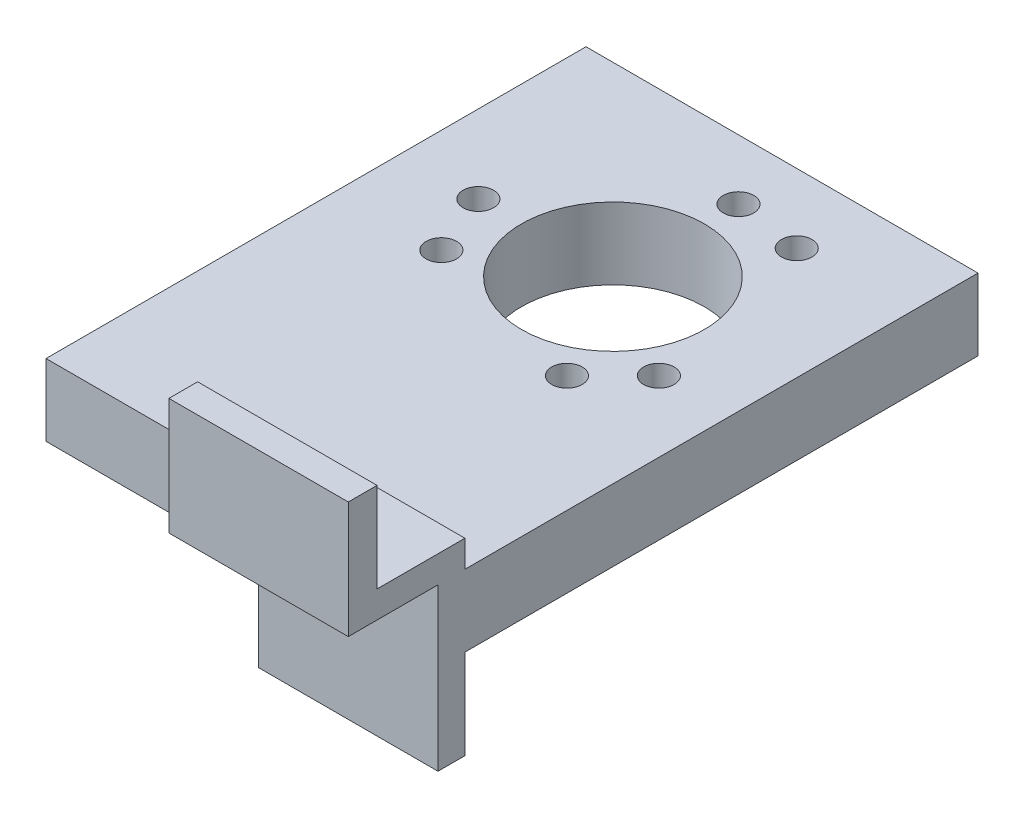
ISO-10303-21;
HEADER;
FILE_DESCRIPTION(('STEP AP214'),'2;1');
FILE_NAME('part.step','',(''),(''),'','','');
FILE_SCHEMA(('AUTOMOTIVE_DESIGN { 1 0 10303 214 1 1 1 1 }'));
ENDSEC;
DATA;
#1=APPLICATION_CONTEXT('core data for automotive mechanical design processes');
#2=APPLICATION_PROTOCOL_DEFINITION('international standard','automotive_design',2000,#1);
#3=PRODUCT_CONTEXT('',#1,'mechanical');
#4=PRODUCT('Part','Part','',(#3));
#5=PRODUCT_RELATED_PRODUCT_CATEGORY('part','',(#4));
#6=PRODUCT_DEFINITION_FORMATION('','',#4);
#7=PRODUCT_DEFINITION_CONTEXT('part definition',#1,'design');
#8=PRODUCT_DEFINITION('design','',#6,#7);
#9=PRODUCT_DEFINITION_SHAPE('','',#8);
#10=(LENGTH_UNIT() NAMED_UNIT(*) SI_UNIT(.MILLI.,.METRE.));
#11=(NAMED_UNIT(*) PLANE_ANGLE_UNIT() SI_UNIT($,.RADIAN.));
#12=(NAMED_UNIT(*) SI_UNIT($,.STERADIAN.) SOLID_ANGLE_UNIT());
#13=UNCERTAINTY_MEASURE_WITH_UNIT(LENGTH_MEASURE(1.E-05),#10,'distance_accuracy_value','');
#14=(GEOMETRIC_REPRESENTATION_CONTEXT(3) GLOBAL_UNCERTAINTY_ASSIGNED_CONTEXT((#13)) GLOBAL_UNIT_ASSIGNED_CONTEXT((#10,
#11,#12)) REPRESENTATION_CONTEXT('',''));
#15=CARTESIAN_POINT('',(0.,0.,0.));
#16=DIRECTION('',(0.,0.,1.));
#17=DIRECTION('',(1.,0.,0.));
#18=AXIS2_PLACEMENT_3D('',#15,#16,#17);
#19=CARTESIAN_POINT('',(0.,8.,0.));
#20=DIRECTION('',(0.,0.,-1.));
#21=DIRECTION('',(-1.,0.,0.));
#22=AXIS2_PLACEMENT_3D('',#19,#20,#21);
#23=PLANE('',#22);
#24=DIRECTION('',(1.,0.,0.));
#25=VECTOR('',#24,1.);
#26=CARTESIAN_POINT('',(0.,8.,0.));
#27=LINE('',#26,#25);
#28=CARTESIAN_POINT('',(0.,8.,0.));
#29=VERTEX_POINT('',#28);
#30=CARTESIAN_POINT('',(20.,8.,0.));
#31=VERTEX_POINT('',#30);
#32=EDGE_CURVE('E62',#29,#31,#27,.T.);
#33=ORIENTED_EDGE('',*,*,#32,.F.);
#34=DIRECTION('',(1.,0.,0.));
#35=VECTOR('',#34,1.);
#36=CARTESIAN_POINT('',(0.,8.,0.));
#37=LINE('',#36,#35);
#38=CARTESIAN_POINT('',(-23.7,8.,0.));
#39=VERTEX_POINT('',#38);
#40=EDGE_CURVE('E250',#39,#29,#37,.T.);
#41=ORIENTED_EDGE('',*,*,#40,.F.);
#42=DIRECTION('',(0.,-1.,0.));
#43=VECTOR('',#42,1.);
#44=CARTESIAN_POINT('',(-23.7,8.,0.));
#45=LINE('',#44,#43);
#46=CARTESIAN_POINT('',(-23.7,0.,0.));
#47=VERTEX_POINT('',#46);
#48=EDGE_CURVE('E287',#39,#47,#45,.T.);
#49=ORIENTED_EDGE('',*,*,#48,.T.);
#50=DIRECTION('',(1.,0.,0.));
#51=VECTOR('',#50,1.);
#52=CARTESIAN_POINT('',(0.,0.,0.));
#53=LINE('',#52,#51);
#54=CARTESIAN_POINT('',(0.,0.,0.));
#55=VERTEX_POINT('',#54);
#56=EDGE_CURVE('E281',#47,#55,#53,.T.);
#57=ORIENTED_EDGE('',*,*,#56,.T.);
#58=DIRECTION('',(0.,1.,0.));
#59=VECTOR('',#58,1.);
#60=CARTESIAN_POINT('',(0.,-10.,0.));
#61=LINE('',#60,#59);
#62=CARTESIAN_POINT('',(0.,-10.,0.));
#63=VERTEX_POINT('',#62);
#64=EDGE_CURVE('E218',#63,#55,#61,.T.);
#65=ORIENTED_EDGE('',*,*,#64,.F.);
#66=DIRECTION('',(-1.,0.,0.));
#67=VECTOR('',#66,1.);
#68=CARTESIAN_POINT('',(20.,-10.,0.));
#69=LINE('',#68,#67);
#70=CARTESIAN_POINT('',(20.,-10.,0.));
#71=VERTEX_POINT('',#70);
#72=EDGE_CURVE('E201',#71,#63,#69,.T.);
#73=ORIENTED_EDGE('',*,*,#72,.F.);
#74=DIRECTION('',(0.,-1.,0.));
#75=VECTOR('',#74,1.);
#76=CARTESIAN_POINT('',(20.,8.,0.));
#77=LINE('',#76,#75);
#78=EDGE_CURVE('E255',#31,#71,#77,.T.);
#79=ORIENTED_EDGE('',*,*,#78,.F.);
#80=EDGE_LOOP('',(#33,#41,#49,#57,#65,#73,#79));
#81=FACE_BOUND('',#80,.T.);
#82=ADVANCED_FACE('F39',(#81),#23,.F.);
#83=CARTESIAN_POINT('',(0.,0.,0.));
#84=DIRECTION('',(0.,1.,0.));
#85=DIRECTION('',(0.,0.,1.));
#86=AXIS2_PLACEMENT_3D('',#83,#84,#85);
#87=PLANE('',#86);
#88=CARTESIAN_POINT('',(-12.1243556529821,0.,-32.5));
#89=DIRECTION('',(0.,1.,0.));
#90=DIRECTION('',(0.,0.,1.));
#91=AXIS2_PLACEMENT_3D('',#88,#89,#90);
#92=CIRCLE('',#91,1.7);
#93=CARTESIAN_POINT('',(-12.1243556529821,0.,-30.8));
#94=VERTEX_POINT('',#93);
#95=EDGE_CURVE('E226',#94,#94,#92,.T.);
#96=ORIENTED_EDGE('',*,*,#95,.T.);
#97=EDGE_LOOP('',(#96));
#98=FACE_BOUND('',#97,.T.);
#99=CARTESIAN_POINT('',(7.,0.,-27.3756443470179));
#100=DIRECTION('',(0.,1.,0.));
#101=DIRECTION('',(0.,0.,1.));
#102=AXIS2_PLACEMENT_3D('',#99,#100,#101);
#103=CIRCLE('',#102,1.7);
#104=CARTESIAN_POINT('',(7.,0.,-25.6756443470179));
#105=VERTEX_POINT('',#104);
#106=EDGE_CURVE('E270',#105,#105,#103,.T.);
#107=ORIENTED_EDGE('',*,*,#106,.T.);
#108=EDGE_LOOP('',(#107));
#109=FACE_BOUND('',#108,.T.);
#110=CARTESIAN_POINT('',(-15.,0.,-39.5));
#111=DIRECTION('',(0.,1.,0.));
#112=DIRECTION('',(0.,0.,1.));
#113=AXIS2_PLACEMENT_3D('',#110,#111,#112);
#114=CIRCLE('',#113,1.7);
#115=CARTESIAN_POINT('',(-15.,0.,-37.8));
#116=VERTEX_POINT('',#115);
#117=EDGE_CURVE('E267',#116,#116,#114,.T.);
#118=ORIENTED_EDGE('',*,*,#117,.T.);
#119=EDGE_LOOP('',(#118));
#120=FACE_BOUND('',#119,.T.);
#121=CARTESIAN_POINT('',(12.1243556529821,0.,-32.5));
#122=DIRECTION('',(0.,1.,0.));
#123=DIRECTION('',(0.,0.,1.));
#124=AXIS2_PLACEMENT_3D('',#121,#122,#123);
#125=CIRCLE('',#124,1.7);
#126=CARTESIAN_POINT('',(12.1243556529821,0.,-30.8));
#127=VERTEX_POINT('',#126);
#128=EDGE_CURVE('E264',#127,#127,#125,.T.);
#129=ORIENTED_EDGE('',*,*,#128,.T.);
#130=EDGE_LOOP('',(#129));
#131=FACE_BOUND('',#130,.T.);
#132=CARTESIAN_POINT('',(0.,0.,-39.5));
#133=DIRECTION('',(0.,1.,0.));
#134=DIRECTION('',(0.,0.,1.));
#135=AXIS2_PLACEMENT_3D('',#132,#133,#134);
#136=CIRCLE('',#135,10.2);
#137=CARTESIAN_POINT('',(0.,0.,-29.3));
#138=VERTEX_POINT('',#137);
#139=EDGE_CURVE('E261',#138,#138,#136,.T.);
#140=ORIENTED_EDGE('',*,*,#139,.T.);
#141=EDGE_LOOP('',(#140));
#142=FACE_BOUND('',#141,.T.);
#143=CARTESIAN_POINT('',(0.,0.,-53.5));
#144=DIRECTION('',(0.,1.,0.));
#145=DIRECTION('',(0.,0.,1.));
#146=AXIS2_PLACEMENT_3D('',#143,#144,#145);
#147=CIRCLE('',#146,1.7);
#148=CARTESIAN_POINT('',(0.,0.,-51.8));
#149=VERTEX_POINT('',#148);
#150=EDGE_CURVE('E258',#149,#149,#147,.T.);
#151=ORIENTED_EDGE('',*,*,#150,.T.);
#152=EDGE_LOOP('',(#151));
#153=FACE_BOUND('',#152,.T.);
#154=CARTESIAN_POINT('',(7.5,0.,-52.4903810567666));
#155=DIRECTION('',(0.,1.,0.));
#156=DIRECTION('',(0.,0.,1.));
#157=AXIS2_PLACEMENT_3D('',#154,#155,#156);
#158=CIRCLE('',#157,1.7);
#159=CARTESIAN_POINT('',(7.5,0.,-50.7903810567666));
#160=VERTEX_POINT('',#159);
#161=EDGE_CURVE('E221',#160,#160,#158,.T.);
#162=ORIENTED_EDGE('',*,*,#161,.T.);
#163=EDGE_LOOP('',(#162));
#164=FACE_BOUND('',#163,.T.);
#165=DIRECTION('',(1.,0.,0.));
#166=VECTOR('',#165,1.);
#167=CARTESIAN_POINT('',(20.,0.,-3.));
#168=LINE('',#167,#166);
#169=CARTESIAN_POINT('',(0.,0.,-3.));
#170=VERTEX_POINT('',#169);
#171=CARTESIAN_POINT('',(20.,0.,-3.));
#172=VERTEX_POINT('',#171);
#173=EDGE_CURVE('E202',#170,#172,#168,.T.);
#174=ORIENTED_EDGE('',*,*,#173,.F.);
#175=DIRECTION('',(0.,0.,-1.));
#176=VECTOR('',#175,1.);
#177=CARTESIAN_POINT('',(0.,0.,0.));
#178=LINE('',#177,#176);
#179=EDGE_CURVE('E197',#55,#170,#178,.T.);
#180=ORIENTED_EDGE('',*,*,#179,.F.);
#181=ORIENTED_EDGE('',*,*,#56,.F.);
#182=DIRECTION('',(0.,0.,-1.));
#183=VECTOR('',#182,1.);
#184=CARTESIAN_POINT('',(-23.7,0.,0.));
#185=LINE('',#184,#183);
#186=CARTESIAN_POINT('',(-23.7,0.,-60.2));
#187=VERTEX_POINT('',#186);
#188=EDGE_CURVE('E278',#47,#187,#185,.T.);
#189=ORIENTED_EDGE('',*,*,#188,.T.);
#190=DIRECTION('',(1.,0.,0.));
#191=VECTOR('',#190,1.);
#192=CARTESIAN_POINT('',(0.,0.,-60.2));
#193=LINE('',#192,#191);
#194=CARTESIAN_POINT('',(20.,0.,-60.2));
#195=VERTEX_POINT('',#194);
#196=EDGE_CURVE('E275',#187,#195,#193,.T.);
#197=ORIENTED_EDGE('',*,*,#196,.T.);
#198=DIRECTION('',(0.,0.,1.));
#199=VECTOR('',#198,1.);
#200=CARTESIAN_POINT('',(20.,0.,0.));
#201=LINE('',#200,#199);
#202=EDGE_CURVE('E273',#195,#172,#201,.T.);
#203=ORIENTED_EDGE('',*,*,#202,.T.);
#204=EDGE_LOOP('',(#174,#180,#181,#189,#197,#203));
#205=FACE_BOUND('',#204,.T.);
#206=ADVANCED_FACE('F299',(#98,#109,#120,#131,#142,#153,#164,#205),#87,.F.);
#207=CARTESIAN_POINT('',(20.,8.,0.));
#208=DIRECTION('',(1.,0.,0.));
#209=DIRECTION('',(0.,0.,-1.));
#210=AXIS2_PLACEMENT_3D('',#207,#208,#209);
#211=PLANE('',#210);
#212=ORIENTED_EDGE('',*,*,#202,.F.);
#213=DIRECTION('',(0.,-1.,0.));
#214=VECTOR('',#213,1.);
#215=CARTESIAN_POINT('',(20.,8.,-60.2));
#216=LINE('',#215,#214);
#217=CARTESIAN_POINT('',(20.,8.,-60.2));
#218=VERTEX_POINT('',#217);
#219=EDGE_CURVE('E11',#218,#195,#216,.T.);
#220=ORIENTED_EDGE('',*,*,#219,.F.);
#221=DIRECTION('',(0.,0.,1.));
#222=VECTOR('',#221,1.);
#223=CARTESIAN_POINT('',(20.,8.,0.));
#224=LINE('',#223,#222);
#225=CARTESIAN_POINT('',(20.,8.,-3.));
#226=VERTEX_POINT('',#225);
#227=EDGE_CURVE('E241',#218,#226,#224,.T.);
#228=ORIENTED_EDGE('',*,*,#227,.T.);
#229=DIRECTION('',(0.,-1.,0.));
#230=VECTOR('',#229,1.);
#231=CARTESIAN_POINT('',(20.,11.,-3.));
#232=LINE('',#231,#230);
#233=CARTESIAN_POINT('',(20.,11.,-3.));
#234=VERTEX_POINT('',#233);
#235=EDGE_CURVE('E194',#234,#226,#232,.T.);
#236=ORIENTED_EDGE('',*,*,#235,.F.);
#237=DIRECTION('',(0.,0.,-1.));
#238=VECTOR('',#237,1.);
#239=CARTESIAN_POINT('',(20.,11.,0.));
#240=LINE('',#239,#238);
#241=CARTESIAN_POINT('',(20.,11.,6.79679823591261));
#242=VERTEX_POINT('',#241);
#243=EDGE_CURVE('E181',#242,#234,#240,.T.);
#244=ORIENTED_EDGE('',*,*,#243,.F.);
#245=DIRECTION('',(0.,-1.,0.));
#246=VECTOR('',#245,1.);
#247=CARTESIAN_POINT('',(20.,21.,6.79679823591261));
#248=LINE('',#247,#246);
#249=CARTESIAN_POINT('',(20.,21.,6.79679823591261));
#250=VERTEX_POINT('',#249);
#251=EDGE_CURVE('E170',#250,#242,#248,.T.);
#252=ORIENTED_EDGE('',*,*,#251,.F.);
#253=DIRECTION('',(0.,0.,-1.));
#254=VECTOR('',#253,1.);
#255=CARTESIAN_POINT('',(20.,21.,10.));
#256=LINE('',#255,#254);
#257=CARTESIAN_POINT('',(20.,21.,10.));
#258=VERTEX_POINT('',#257);
#259=EDGE_CURVE('E157',#258,#250,#256,.T.);
#260=ORIENTED_EDGE('',*,*,#259,.F.);
#261=DIRECTION('',(0.,1.,0.));
#262=VECTOR('',#261,1.);
#263=CARTESIAN_POINT('',(20.,11.,10.));
#264=LINE('',#263,#262);
#265=CARTESIAN_POINT('',(20.,8.,10.));
#266=VERTEX_POINT('',#265);
#267=EDGE_CURVE('E154',#266,#258,#264,.T.);
#268=ORIENTED_EDGE('',*,*,#267,.F.);
#269=DIRECTION('',(0.,0.,-1.));
#270=VECTOR('',#269,1.);
#271=CARTESIAN_POINT('',(20.,8.,10.));
#272=LINE('',#271,#270);
#273=EDGE_CURVE('E175',#266,#31,#272,.T.);
#274=ORIENTED_EDGE('',*,*,#273,.T.);
#275=ORIENTED_EDGE('',*,*,#78,.T.);
#276=DIRECTION('',(0.,0.,1.));
#277=VECTOR('',#276,1.);
#278=CARTESIAN_POINT('',(20.,-10.,0.));
#279=LINE('',#278,#277);
#280=CARTESIAN_POINT('',(20.,-10.,-3.));
#281=VERTEX_POINT('',#280);
#282=EDGE_CURVE('E198',#281,#71,#279,.T.);
#283=ORIENTED_EDGE('',*,*,#282,.F.);
#284=DIRECTION('',(0.,1.,0.));
#285=VECTOR('',#284,1.);
#286=CARTESIAN_POINT('',(20.,-10.,-3.));
#287=LINE('',#286,#285);
#288=EDGE_CURVE('E208',#281,#172,#287,.T.);
#289=ORIENTED_EDGE('',*,*,#288,.T.);
#290=EDGE_LOOP('',(#212,#220,#228,#236,#244,#252,#260,#268,#274,#275,#283,#289));
#291=FACE_BOUND('',#290,.T.);
#292=ADVANCED_FACE('F315',(#291),#211,.T.);
#293=CARTESIAN_POINT('',(0.,8.,-60.2));
#294=DIRECTION('',(0.,0.,-1.));
#295=DIRECTION('',(-1.,0.,0.));
#296=AXIS2_PLACEMENT_3D('',#293,#294,#295);
#297=PLANE('',#296);
#298=ORIENTED_EDGE('',*,*,#196,.F.);
#299=DIRECTION('',(0.,-1.,0.));
#300=VECTOR('',#299,1.);
#301=CARTESIAN_POINT('',(-23.7,8.,-60.2));
#302=LINE('',#301,#300);
#303=CARTESIAN_POINT('',(-23.7,8.,-60.2));
#304=VERTEX_POINT('',#303);
#305=EDGE_CURVE('E47',#304,#187,#302,.T.);
#306=ORIENTED_EDGE('',*,*,#305,.F.);
#307=DIRECTION('',(1.,0.,0.));
#308=VECTOR('',#307,1.);
#309=CARTESIAN_POINT('',(0.,8.,-60.2));
#310=LINE('',#309,#308);
#311=EDGE_CURVE('E244',#304,#218,#310,.T.);
#312=ORIENTED_EDGE('',*,*,#311,.T.);
#313=ORIENTED_EDGE('',*,*,#219,.T.);
#314=EDGE_LOOP('',(#298,#306,#312,#313));
#315=FACE_BOUND('',#314,.T.);
#316=ADVANCED_FACE('F295',(#315),#297,.T.);
#317=CARTESIAN_POINT('',(-23.7,8.,0.));
#318=DIRECTION('',(-1.,0.,0.));
#319=DIRECTION('',(0.,0.,1.));
#320=AXIS2_PLACEMENT_3D('',#317,#318,#319);
#321=PLANE('',#320);
#322=ORIENTED_EDGE('',*,*,#188,.F.);
#323=ORIENTED_EDGE('',*,*,#48,.F.);
#324=DIRECTION('',(0.,0.,-1.));
#325=VECTOR('',#324,1.);
#326=CARTESIAN_POINT('',(-23.7,8.,0.));
#327=LINE('',#326,#325);
#328=EDGE_CURVE('E247',#39,#304,#327,.T.);
#329=ORIENTED_EDGE('',*,*,#328,.T.);
#330=ORIENTED_EDGE('',*,*,#305,.T.);
#331=EDGE_LOOP('',(#322,#323,#329,#330));
#332=FACE_BOUND('',#331,.T.);
#333=ADVANCED_FACE('F291',(#332),#321,.T.);
#334=CARTESIAN_POINT('',(7.,8.,-27.3756443470179));
#335=DIRECTION('',(0.,-1.,0.));
#336=DIRECTION('',(0.,0.,-1.));
#337=AXIS2_PLACEMENT_3D('',#334,#335,#336);
#338=CYLINDRICAL_SURFACE('',#337,1.7);
#339=CARTESIAN_POINT('',(7.,8.,-27.3756443470179));
#340=DIRECTION('',(0.,1.,0.));
#341=DIRECTION('',(0.,0.,1.));
#342=AXIS2_PLACEMENT_3D('',#339,#340,#341);
#343=CIRCLE('',#342,1.7);
#344=CARTESIAN_POINT('',(7.,8.,-25.6756443470179));
#345=VERTEX_POINT('',#344);
#346=EDGE_CURVE('E238',#345,#345,#343,.T.);
#347=ORIENTED_EDGE('',*,*,#346,.T.);
#348=EDGE_LOOP('',(#347));
#349=FACE_BOUND('',#348,.T.);
#350=ORIENTED_EDGE('',*,*,#106,.F.);
#351=EDGE_LOOP('',(#350));
#352=FACE_BOUND('',#351,.T.);
#353=ADVANCED_FACE('F352',(#349,#352),#338,.F.);
#354=CARTESIAN_POINT('',(-15.,8.,-39.5));
#355=DIRECTION('',(0.,-1.,0.));
#356=DIRECTION('',(0.,0.,-1.));
#357=AXIS2_PLACEMENT_3D('',#354,#355,#356);
#358=CYLINDRICAL_SURFACE('',#357,1.7);
#359=CARTESIAN_POINT('',(-15.,8.,-39.5));
#360=DIRECTION('',(0.,1.,0.));
#361=DIRECTION('',(0.,0.,1.));
#362=AXIS2_PLACEMENT_3D('',#359,#360,#361);
#363=CIRCLE('',#362,1.7);
#364=CARTESIAN_POINT('',(-15.,8.,-37.8));
#365=VERTEX_POINT('',#364);
#366=EDGE_CURVE('E235',#365,#365,#363,.T.);
#367=ORIENTED_EDGE('',*,*,#366,.T.);
#368=EDGE_LOOP('',(#367));
#369=FACE_BOUND('',#368,.T.);
#370=ORIENTED_EDGE('',*,*,#117,.F.);
#371=EDGE_LOOP('',(#370));
#372=FACE_BOUND('',#371,.T.);
#373=ADVANCED_FACE('F359',(#369,#372),#358,.F.);
#374=CARTESIAN_POINT('',(12.1243556529821,8.,-32.5));
#375=DIRECTION('',(0.,-1.,0.));
#376=DIRECTION('',(0.,0.,-1.));
#377=AXIS2_PLACEMENT_3D('',#374,#375,#376);
#378=CYLINDRICAL_SURFACE('',#377,1.7);
#379=CARTESIAN_POINT('',(12.1243556529821,8.,-32.5));
#380=DIRECTION('',(0.,1.,0.));
#381=DIRECTION('',(0.,0.,1.));
#382=AXIS2_PLACEMENT_3D('',#379,#380,#381);
#383=CIRCLE('',#382,1.7);
#384=CARTESIAN_POINT('',(12.1243556529821,8.,-30.8));
#385=VERTEX_POINT('',#384);
#386=EDGE_CURVE('E232',#385,#385,#383,.T.);
#387=ORIENTED_EDGE('',*,*,#386,.T.);
#388=EDGE_LOOP('',(#387));
#389=FACE_BOUND('',#388,.T.);
#390=ORIENTED_EDGE('',*,*,#128,.F.);
#391=EDGE_LOOP('',(#390));
#392=FACE_BOUND('',#391,.T.);
#393=ADVANCED_FACE('F363',(#389,#392),#378,.F.);
#394=CARTESIAN_POINT('',(0.,8.,-39.5));
#395=DIRECTION('',(0.,-1.,0.));
#396=DIRECTION('',(0.,0.,-1.));
#397=AXIS2_PLACEMENT_3D('',#394,#395,#396);
#398=CYLINDRICAL_SURFACE('',#397,10.2);
#399=CARTESIAN_POINT('',(0.,8.,-39.5));
#400=DIRECTION('',(0.,1.,0.));
#401=DIRECTION('',(0.,0.,1.));
#402=AXIS2_PLACEMENT_3D('',#399,#400,#401);
#403=CIRCLE('',#402,10.2);
#404=CARTESIAN_POINT('',(0.,8.,-29.3));
#405=VERTEX_POINT('',#404);
#406=EDGE_CURVE('E229',#405,#405,#403,.T.);
#407=ORIENTED_EDGE('',*,*,#406,.T.);
#408=EDGE_LOOP('',(#407));
#409=FACE_BOUND('',#408,.T.);
#410=ORIENTED_EDGE('',*,*,#139,.F.);
#411=EDGE_LOOP('',(#410));
#412=FACE_BOUND('',#411,.T.);
#413=ADVANCED_FACE('F367',(#409,#412),#398,.F.);
#414=CARTESIAN_POINT('',(0.,8.,-53.5));
#415=DIRECTION('',(0.,-1.,0.));
#416=DIRECTION('',(0.,0.,-1.));
#417=AXIS2_PLACEMENT_3D('',#414,#415,#416);
#418=CYLINDRICAL_SURFACE('',#417,1.7);
#419=CARTESIAN_POINT('',(0.,8.,-53.5));
#420=DIRECTION('',(0.,1.,0.));
#421=DIRECTION('',(0.,0.,1.));
#422=AXIS2_PLACEMENT_3D('',#419,#420,#421);
#423=CIRCLE('',#422,1.7);
#424=CARTESIAN_POINT('',(0.,8.,-51.8));
#425=VERTEX_POINT('',#424);
#426=EDGE_CURVE('E225',#425,#425,#423,.T.);
#427=ORIENTED_EDGE('',*,*,#426,.T.);
#428=EDGE_LOOP('',(#427));
#429=FACE_BOUND('',#428,.T.);
#430=ORIENTED_EDGE('',*,*,#150,.F.);
#431=EDGE_LOOP('',(#430));
#432=FACE_BOUND('',#431,.T.);
#433=ADVANCED_FACE('F370',(#429,#432),#418,.F.);
#434=CARTESIAN_POINT('',(7.5,8.,-52.4903810567666));
#435=DIRECTION('',(0.,-1.,0.));
#436=DIRECTION('',(0.,0.,-1.));
#437=AXIS2_PLACEMENT_3D('',#434,#435,#436);
#438=CYLINDRICAL_SURFACE('',#437,1.7);
#439=CARTESIAN_POINT('',(7.5,8.,-52.4903810567666));
#440=DIRECTION('',(0.,1.,0.));
#441=DIRECTION('',(0.,0.,1.));
#442=AXIS2_PLACEMENT_3D('',#439,#440,#441);
#443=CIRCLE('',#442,1.7);
#444=CARTESIAN_POINT('',(7.5,8.,-50.7903810567666));
#445=VERTEX_POINT('',#444);
#446=EDGE_CURVE('E222',#445,#445,#443,.T.);
#447=ORIENTED_EDGE('',*,*,#446,.T.);
#448=EDGE_LOOP('',(#447));
#449=FACE_BOUND('',#448,.T.);
#450=ORIENTED_EDGE('',*,*,#161,.F.);
#451=EDGE_LOOP('',(#450));
#452=FACE_BOUND('',#451,.T.);
#453=ADVANCED_FACE('F41',(#449,#452),#438,.F.);
#454=CARTESIAN_POINT('',(-12.1243556529821,8.,-32.5));
#455=DIRECTION('',(0.,-1.,0.));
#456=DIRECTION('',(0.,0.,-1.));
#457=AXIS2_PLACEMENT_3D('',#454,#455,#456);
#458=CYLINDRICAL_SURFACE('',#457,1.7);
#459=CARTESIAN_POINT('',(-12.1243556529821,8.,-32.5));
#460=DIRECTION('',(0.,1.,0.));
#461=DIRECTION('',(0.,0.,1.));
#462=AXIS2_PLACEMENT_3D('',#459,#460,#461);
#463=CIRCLE('',#462,1.7);
#464=CARTESIAN_POINT('',(-12.1243556529821,8.,-30.8));
#465=VERTEX_POINT('',#464);
#466=EDGE_CURVE('E252',#465,#465,#463,.T.);
#467=ORIENTED_EDGE('',*,*,#466,.T.);
#468=EDGE_LOOP('',(#467));
#469=FACE_BOUND('',#468,.T.);
#470=ORIENTED_EDGE('',*,*,#95,.F.);
#471=EDGE_LOOP('',(#470));
#472=FACE_BOUND('',#471,.T.);
#473=ADVANCED_FACE('F349',(#469,#472),#458,.F.);
#474=CARTESIAN_POINT('',(0.,8.,0.));
#475=DIRECTION('',(0.,1.,0.));
#476=DIRECTION('',(0.,0.,1.));
#477=AXIS2_PLACEMENT_3D('',#474,#475,#476);
#478=PLANE('',#477);
#479=DIRECTION('',(0.,0.,1.));
#480=VECTOR('',#479,1.);
#481=CARTESIAN_POINT('',(0.,8.,0.));
#482=LINE('',#481,#480);
#483=CARTESIAN_POINT('',(0.,8.,-3.));
#484=VERTEX_POINT('',#483);
#485=EDGE_CURVE('E184',#484,#29,#482,.T.);
#486=ORIENTED_EDGE('',*,*,#485,.F.);
#487=DIRECTION('',(-1.,0.,0.));
#488=VECTOR('',#487,1.);
#489=CARTESIAN_POINT('',(20.,8.,-3.));
#490=LINE('',#489,#488);
#491=EDGE_CURVE('E180',#226,#484,#490,.T.);
#492=ORIENTED_EDGE('',*,*,#491,.F.);
#493=ORIENTED_EDGE('',*,*,#227,.F.);
#494=ORIENTED_EDGE('',*,*,#311,.F.);
#495=ORIENTED_EDGE('',*,*,#328,.F.);
#496=ORIENTED_EDGE('',*,*,#40,.T.);
#497=EDGE_LOOP('',(#486,#492,#493,#494,#495,#496));
#498=FACE_BOUND('',#497,.T.);
#499=ORIENTED_EDGE('',*,*,#446,.F.);
#500=EDGE_LOOP('',(#499));
#501=FACE_BOUND('',#500,.T.);
#502=ORIENTED_EDGE('',*,*,#426,.F.);
#503=EDGE_LOOP('',(#502));
#504=FACE_BOUND('',#503,.T.);
#505=ORIENTED_EDGE('',*,*,#406,.F.);
#506=EDGE_LOOP('',(#505));
#507=FACE_BOUND('',#506,.T.);
#508=ORIENTED_EDGE('',*,*,#386,.F.);
#509=EDGE_LOOP('',(#508));
#510=FACE_BOUND('',#509,.T.);
#511=ORIENTED_EDGE('',*,*,#366,.F.);
#512=EDGE_LOOP('',(#511));
#513=FACE_BOUND('',#512,.T.);
#514=ORIENTED_EDGE('',*,*,#346,.F.);
#515=EDGE_LOOP('',(#514));
#516=FACE_BOUND('',#515,.T.);
#517=ORIENTED_EDGE('',*,*,#466,.F.);
#518=EDGE_LOOP('',(#517));
#519=FACE_BOUND('',#518,.T.);
#520=ADVANCED_FACE('F328',(#498,#501,#504,#507,#510,#513,#516,#519),#478,.T.);
#521=CARTESIAN_POINT('',(0.,-10.,0.));
#522=DIRECTION('',(1.,0.,0.));
#523=DIRECTION('',(0.,0.,-1.));
#524=AXIS2_PLACEMENT_3D('',#521,#522,#523);
#525=PLANE('',#524);
#526=ORIENTED_EDGE('',*,*,#179,.T.);
#527=DIRECTION('',(0.,1.,0.));
#528=VECTOR('',#527,1.);
#529=CARTESIAN_POINT('',(0.,-10.,-3.));
#530=LINE('',#529,#528);
#531=CARTESIAN_POINT('',(0.,-10.,-3.));
#532=VERTEX_POINT('',#531);
#533=EDGE_CURVE('E215',#532,#170,#530,.T.);
#534=ORIENTED_EDGE('',*,*,#533,.F.);
#535=DIRECTION('',(0.,0.,-1.));
#536=VECTOR('',#535,1.);
#537=CARTESIAN_POINT('',(0.,-10.,0.));
#538=LINE('',#537,#536);
#539=EDGE_CURVE('E204',#63,#532,#538,.T.);
#540=ORIENTED_EDGE('',*,*,#539,.F.);
#541=ORIENTED_EDGE('',*,*,#64,.T.);
#542=EDGE_LOOP('',(#526,#534,#540,#541));
#543=FACE_BOUND('',#542,.T.);
#544=ADVANCED_FACE('F304',(#543),#525,.F.);
#545=CARTESIAN_POINT('',(20.,-10.,-3.));
#546=DIRECTION('',(0.,0.,1.));
#547=DIRECTION('',(1.,0.,0.));
#548=AXIS2_PLACEMENT_3D('',#545,#546,#547);
#549=PLANE('',#548);
#550=ORIENTED_EDGE('',*,*,#173,.T.);
#551=ORIENTED_EDGE('',*,*,#288,.F.);
#552=DIRECTION('',(1.,0.,0.));
#553=VECTOR('',#552,1.);
#554=CARTESIAN_POINT('',(20.,-10.,-3.));
#555=LINE('',#554,#553);
#556=EDGE_CURVE('E206',#532,#281,#555,.T.);
#557=ORIENTED_EDGE('',*,*,#556,.F.);
#558=ORIENTED_EDGE('',*,*,#533,.T.);
#559=EDGE_LOOP('',(#550,#551,#557,#558));
#560=FACE_BOUND('',#559,.T.);
#561=ADVANCED_FACE('F331',(#560),#549,.F.);
#562=CARTESIAN_POINT('',(0.,-10.,0.));
#563=DIRECTION('',(0.,1.,0.));
#564=DIRECTION('',(0.,0.,1.));
#565=AXIS2_PLACEMENT_3D('',#562,#563,#564);
#566=PLANE('',#565);
#567=ORIENTED_EDGE('',*,*,#282,.T.);
#568=ORIENTED_EDGE('',*,*,#72,.T.);
#569=ORIENTED_EDGE('',*,*,#539,.T.);
#570=ORIENTED_EDGE('',*,*,#556,.T.);
#571=EDGE_LOOP('',(#567,#568,#569,#570));
#572=FACE_BOUND('',#571,.T.);
#573=ADVANCED_FACE('F308',(#572),#566,.F.);
#574=CARTESIAN_POINT('',(20.,11.,-3.));
#575=DIRECTION('',(0.,0.,1.));
#576=DIRECTION('',(1.,0.,0.));
#577=AXIS2_PLACEMENT_3D('',#574,#575,#576);
#578=PLANE('',#577);
#579=ORIENTED_EDGE('',*,*,#491,.T.);
#580=DIRECTION('',(0.,-1.,0.));
#581=VECTOR('',#580,1.);
#582=CARTESIAN_POINT('',(0.,11.,-3.));
#583=LINE('',#582,#581);
#584=CARTESIAN_POINT('',(0.,11.,-3.));
#585=VERTEX_POINT('',#584);
#586=EDGE_CURVE('E188',#585,#484,#583,.T.);
#587=ORIENTED_EDGE('',*,*,#586,.F.);
#588=DIRECTION('',(-1.,0.,0.));
#589=VECTOR('',#588,1.);
#590=CARTESIAN_POINT('',(20.,11.,-3.));
#591=LINE('',#590,#589);
#592=EDGE_CURVE('E183',#234,#585,#591,.T.);
#593=ORIENTED_EDGE('',*,*,#592,.F.);
#594=ORIENTED_EDGE('',*,*,#235,.T.);
#595=EDGE_LOOP('',(#579,#587,#593,#594));
#596=FACE_BOUND('',#595,.T.);
#597=ADVANCED_FACE('F325',(#596),#578,.F.);
#598=CARTESIAN_POINT('',(0.,11.,0.));
#599=DIRECTION('',(1.,0.,0.));
#600=DIRECTION('',(0.,0.,-1.));
#601=AXIS2_PLACEMENT_3D('',#598,#599,#600);
#602=PLANE('',#601);
#603=ORIENTED_EDGE('',*,*,#485,.T.);
#604=DIRECTION('',(0.,0.,-1.));
#605=VECTOR('',#604,1.);
#606=CARTESIAN_POINT('',(0.,8.,10.));
#607=LINE('',#606,#605);
#608=CARTESIAN_POINT('',(0.,8.,10.));
#609=VERTEX_POINT('',#608);
#610=EDGE_CURVE('E146',#609,#29,#607,.T.);
#611=ORIENTED_EDGE('',*,*,#610,.F.);
#612=DIRECTION('',(0.,-1.,0.));
#613=VECTOR('',#612,1.);
#614=CARTESIAN_POINT('',(0.,11.,10.));
#615=LINE('',#614,#613);
#616=CARTESIAN_POINT('',(0.,21.,10.));
#617=VERTEX_POINT('',#616);
#618=EDGE_CURVE('E138',#617,#609,#615,.T.);
#619=ORIENTED_EDGE('',*,*,#618,.F.);
#620=DIRECTION('',(0.,0.,1.));
#621=VECTOR('',#620,1.);
#622=CARTESIAN_POINT('',(0.,21.,10.));
#623=LINE('',#622,#621);
#624=CARTESIAN_POINT('',(0.,21.,6.79679823591261));
#625=VERTEX_POINT('',#624);
#626=EDGE_CURVE('E144',#625,#617,#623,.T.);
#627=ORIENTED_EDGE('',*,*,#626,.F.);
#628=DIRECTION('',(0.,-1.,0.));
#629=VECTOR('',#628,1.);
#630=CARTESIAN_POINT('',(0.,21.,6.79679823591261));
#631=LINE('',#630,#629);
#632=CARTESIAN_POINT('',(0.,11.,6.79679823591261));
#633=VERTEX_POINT('',#632);
#634=EDGE_CURVE('E167',#625,#633,#631,.T.);
#635=ORIENTED_EDGE('',*,*,#634,.T.);
#636=DIRECTION('',(0.,0.,1.));
#637=VECTOR('',#636,1.);
#638=CARTESIAN_POINT('',(0.,11.,0.));
#639=LINE('',#638,#637);
#640=EDGE_CURVE('E186',#585,#633,#639,.T.);
#641=ORIENTED_EDGE('',*,*,#640,.F.);
#642=ORIENTED_EDGE('',*,*,#586,.T.);
#643=EDGE_LOOP('',(#603,#611,#619,#627,#635,#641,#642));
#644=FACE_BOUND('',#643,.T.);
#645=ADVANCED_FACE('F141',(#644),#602,.F.);
#646=CARTESIAN_POINT('',(0.,11.,0.));
#647=DIRECTION('',(0.,1.,0.));
#648=DIRECTION('',(0.,0.,1.));
#649=AXIS2_PLACEMENT_3D('',#646,#647,#648);
#650=PLANE('',#649);
#651=DIRECTION('',(-1.,0.,0.));
#652=VECTOR('',#651,1.);
#653=CARTESIAN_POINT('',(0.,11.,6.79679823591261));
#654=LINE('',#653,#652);
#655=EDGE_CURVE('E54',#242,#633,#654,.T.);
#656=ORIENTED_EDGE('',*,*,#655,.F.);
#657=ORIENTED_EDGE('',*,*,#243,.T.);
#658=ORIENTED_EDGE('',*,*,#592,.T.);
#659=ORIENTED_EDGE('',*,*,#640,.T.);
#660=EDGE_LOOP('',(#656,#657,#658,#659));
#661=FACE_BOUND('',#660,.T.);
#662=ADVANCED_FACE('F322',(#661),#650,.T.);
#663=CARTESIAN_POINT('',(0.,8.,10.));
#664=DIRECTION('',(0.,1.,0.));
#665=DIRECTION('',(0.,0.,1.));
#666=AXIS2_PLACEMENT_3D('',#663,#664,#665);
#667=PLANE('',#666);
#668=ORIENTED_EDGE('',*,*,#32,.T.);
#669=ORIENTED_EDGE('',*,*,#273,.F.);
#670=DIRECTION('',(1.,0.,0.));
#671=VECTOR('',#670,1.);
#672=CARTESIAN_POINT('',(0.,8.,10.));
#673=LINE('',#672,#671);
#674=EDGE_CURVE('E148',#609,#266,#673,.T.);
#675=ORIENTED_EDGE('',*,*,#674,.F.);
#676=ORIENTED_EDGE('',*,*,#610,.T.);
#677=EDGE_LOOP('',(#668,#669,#675,#676));
#678=FACE_BOUND('',#677,.T.);
#679=ADVANCED_FACE('F314',(#678),#667,.F.);
#680=CARTESIAN_POINT('',(0.,0.,10.));
#681=DIRECTION('',(0.,0.,1.));
#682=DIRECTION('',(1.,0.,0.));
#683=AXIS2_PLACEMENT_3D('',#680,#681,#682);
#684=PLANE('',#683);
#685=ORIENTED_EDGE('',*,*,#618,.T.);
#686=ORIENTED_EDGE('',*,*,#674,.T.);
#687=ORIENTED_EDGE('',*,*,#267,.T.);
#688=DIRECTION('',(1.,0.,0.));
#689=VECTOR('',#688,1.);
#690=CARTESIAN_POINT('',(0.,21.,10.));
#691=LINE('',#690,#689);
#692=EDGE_CURVE('E151',#617,#258,#691,.T.);
#693=ORIENTED_EDGE('',*,*,#692,.F.);
#694=EDGE_LOOP('',(#685,#686,#687,#693));
#695=FACE_BOUND('',#694,.T.);
#696=ADVANCED_FACE('F152',(#695),#684,.T.);
#697=CARTESIAN_POINT('',(0.,21.,6.79679823591261));
#698=DIRECTION('',(0.,0.,1.));
#699=DIRECTION('',(1.,0.,0.));
#700=AXIS2_PLACEMENT_3D('',#697,#698,#699);
#701=PLANE('',#700);
#702=ORIENTED_EDGE('',*,*,#655,.T.);
#703=ORIENTED_EDGE('',*,*,#634,.F.);
#704=DIRECTION('',(-1.,0.,0.));
#705=VECTOR('',#704,1.);
#706=CARTESIAN_POINT('',(0.,21.,6.79679823591261));
#707=LINE('',#706,#705);
#708=EDGE_CURVE('E161',#250,#625,#707,.T.);
#709=ORIENTED_EDGE('',*,*,#708,.F.);
#710=ORIENTED_EDGE('',*,*,#251,.T.);
#711=EDGE_LOOP('',(#702,#703,#709,#710));
#712=FACE_BOUND('',#711,.T.);
#713=ADVANCED_FACE('F319',(#712),#701,.F.);
#714=CARTESIAN_POINT('',(0.,21.,0.));
#715=DIRECTION('',(0.,-1.,0.));
#716=DIRECTION('',(0.,0.,-1.));
#717=AXIS2_PLACEMENT_3D('',#714,#715,#716);
#718=PLANE('',#717);
#719=ORIENTED_EDGE('',*,*,#626,.T.);
#720=ORIENTED_EDGE('',*,*,#692,.T.);
#721=ORIENTED_EDGE('',*,*,#259,.T.);
#722=ORIENTED_EDGE('',*,*,#708,.T.);
#723=EDGE_LOOP('',(#719,#720,#721,#722));
#724=FACE_BOUND('',#723,.T.);
#725=ADVANCED_FACE('F159',(#724),#718,.F.);
#726=CLOSED_SHELL('',(#82,#206,#292,#316,#333,#353,#373,#393,#413,#433,#453,#473,#520,#544,#561,
#573,#597,#645,#662,#679,#696,#713,#725));
#727=MANIFOLD_SOLID_BREP('B2',#726);
#728=ADVANCED_BREP_SHAPE_REPRESENTATION('',(#18,#727),#14);
#729=SHAPE_DEFINITION_REPRESENTATION(#9,#728);
ENDSEC;
END-ISO-10303-21;
